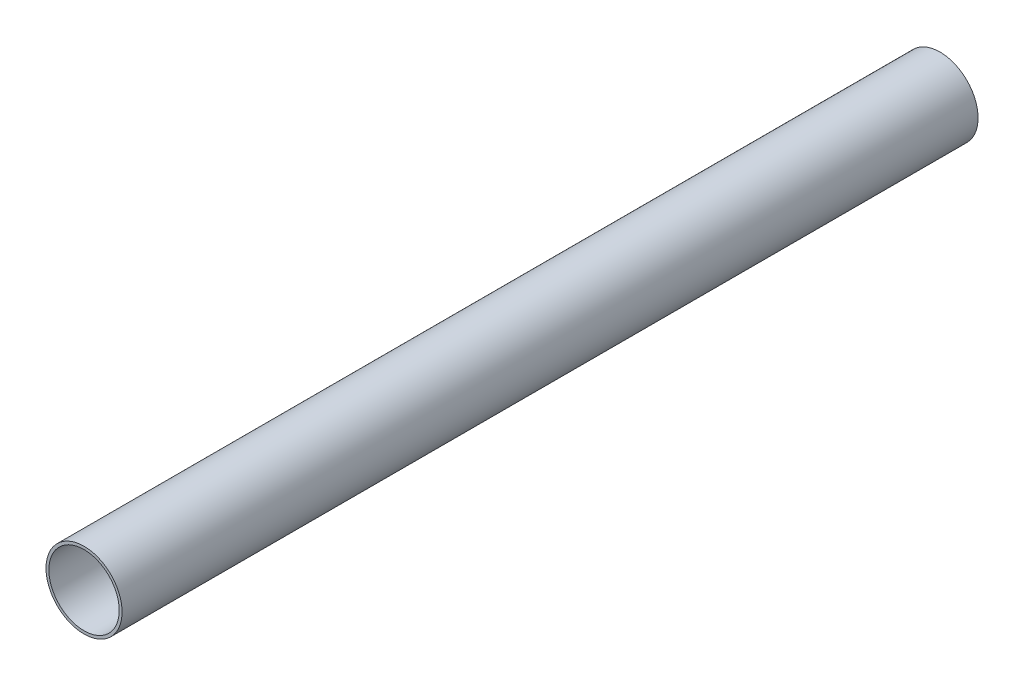
ISO-10303-21;
HEADER;
FILE_DESCRIPTION(('STEP AP214'),'2;1');
FILE_NAME('part.step','',(''),(''),'','','');
FILE_SCHEMA(('AUTOMOTIVE_DESIGN { 1 0 10303 214 1 1 1 1 }'));
ENDSEC;
DATA;
#1=APPLICATION_CONTEXT('core data for automotive mechanical design processes');
#2=APPLICATION_PROTOCOL_DEFINITION('international standard','automotive_design',2000,#1);
#3=PRODUCT_CONTEXT('',#1,'mechanical');
#4=PRODUCT('Part','Part','',(#3));
#5=PRODUCT_RELATED_PRODUCT_CATEGORY('part','',(#4));
#6=PRODUCT_DEFINITION_FORMATION('','',#4);
#7=PRODUCT_DEFINITION_CONTEXT('part definition',#1,'design');
#8=PRODUCT_DEFINITION('design','',#6,#7);
#9=PRODUCT_DEFINITION_SHAPE('','',#8);
#10=(LENGTH_UNIT() NAMED_UNIT(*) SI_UNIT(.MILLI.,.METRE.));
#11=(NAMED_UNIT(*) PLANE_ANGLE_UNIT() SI_UNIT($,.RADIAN.));
#12=(NAMED_UNIT(*) SI_UNIT($,.STERADIAN.) SOLID_ANGLE_UNIT());
#13=UNCERTAINTY_MEASURE_WITH_UNIT(LENGTH_MEASURE(1.E-05),#10,'distance_accuracy_value','');
#14=(GEOMETRIC_REPRESENTATION_CONTEXT(3) GLOBAL_UNCERTAINTY_ASSIGNED_CONTEXT((#13)) GLOBAL_UNIT_ASSIGNED_CONTEXT((#10,
#11,#12)) REPRESENTATION_CONTEXT('',''));
#15=CARTESIAN_POINT('',(0.,0.,0.));
#16=DIRECTION('',(0.,0.,1.));
#17=DIRECTION('',(1.,0.,0.));
#18=AXIS2_PLACEMENT_3D('',#15,#16,#17);
#19=CARTESIAN_POINT('',(0.,0.,180.));
#20=DIRECTION('',(0.,0.,1.));
#21=DIRECTION('',(1.,0.,0.));
#22=AXIS2_PLACEMENT_3D('',#19,#20,#21);
#23=PLANE('',#22);
#24=CARTESIAN_POINT('',(0.,0.,180.));
#25=DIRECTION('',(0.,0.,1.));
#26=DIRECTION('',(1.,0.,0.));
#27=AXIS2_PLACEMENT_3D('',#24,#25,#26);
#28=CIRCLE('',#27,8.);
#29=CARTESIAN_POINT('',(-8.,0.,180.));
#30=VERTEX_POINT('',#29);
#31=EDGE_CURVE('E12',#30,#30,#28,.T.);
#32=ORIENTED_EDGE('',*,*,#31,.T.);
#33=EDGE_LOOP('',(#32));
#34=FACE_BOUND('',#33,.T.);
#35=CARTESIAN_POINT('',(0.,0.,180.));
#36=DIRECTION('',(0.,0.,1.));
#37=DIRECTION('',(1.,0.,0.));
#38=AXIS2_PLACEMENT_3D('',#35,#36,#37);
#39=CIRCLE('',#38,7.4);
#40=CARTESIAN_POINT('',(-7.4,0.,180.));
#41=VERTEX_POINT('',#40);
#42=EDGE_CURVE('E50',#41,#41,#39,.T.);
#43=ORIENTED_EDGE('',*,*,#42,.F.);
#44=EDGE_LOOP('',(#43));
#45=FACE_BOUND('',#44,.T.);
#46=ADVANCED_FACE('F39',(#34,#45),#23,.T.);
#47=CARTESIAN_POINT('',(0.,0.,0.));
#48=DIRECTION('',(0.,0.,1.));
#49=DIRECTION('',(1.,0.,0.));
#50=AXIS2_PLACEMENT_3D('',#47,#48,#49);
#51=PLANE('',#50);
#52=CARTESIAN_POINT('',(0.,0.,0.));
#53=DIRECTION('',(0.,0.,1.));
#54=DIRECTION('',(1.,0.,0.));
#55=AXIS2_PLACEMENT_3D('',#52,#53,#54);
#56=CIRCLE('',#55,8.);
#57=CARTESIAN_POINT('',(-8.,0.,0.));
#58=VERTEX_POINT('',#57);
#59=EDGE_CURVE('E43',#58,#58,#56,.T.);
#60=ORIENTED_EDGE('',*,*,#59,.F.);
#61=EDGE_LOOP('',(#60));
#62=FACE_BOUND('',#61,.T.);
#63=CARTESIAN_POINT('',(0.,0.,0.));
#64=DIRECTION('',(0.,0.,1.));
#65=DIRECTION('',(1.,0.,0.));
#66=AXIS2_PLACEMENT_3D('',#63,#64,#65);
#67=CIRCLE('',#66,7.4);
#68=CARTESIAN_POINT('',(-7.4,0.,0.));
#69=VERTEX_POINT('',#68);
#70=EDGE_CURVE('E52',#69,#69,#67,.T.);
#71=ORIENTED_EDGE('',*,*,#70,.T.);
#72=EDGE_LOOP('',(#71));
#73=FACE_BOUND('',#72,.T.);
#74=ADVANCED_FACE('F62',(#62,#73),#51,.F.);
#75=CARTESIAN_POINT('',(0.,0.,180.));
#76=DIRECTION('',(0.,0.,-1.));
#77=DIRECTION('',(-1.,0.,0.));
#78=AXIS2_PLACEMENT_3D('',#75,#76,#77);
#79=CYLINDRICAL_SURFACE('',#78,8.);
#80=CARTESIAN_POINT('',(-8.,0.,180.));
#81=CARTESIAN_POINT('',(-8.,0.,178.125));
#82=CARTESIAN_POINT('',(-8.,0.,176.25));
#83=CARTESIAN_POINT('',(-8.,0.,172.5));
#84=CARTESIAN_POINT('',(-8.,0.,170.625));
#85=CARTESIAN_POINT('',(-8.,0.,166.875));
#86=CARTESIAN_POINT('',(-8.,0.,165.));
#87=CARTESIAN_POINT('',(-8.,0.,161.25));
#88=CARTESIAN_POINT('',(-8.,0.,159.375));
#89=CARTESIAN_POINT('',(-8.,0.,155.625));
#90=CARTESIAN_POINT('',(-8.,0.,153.75));
#91=CARTESIAN_POINT('',(-8.,0.,150.));
#92=CARTESIAN_POINT('',(-8.,0.,148.125));
#93=CARTESIAN_POINT('',(-8.,0.,144.375));
#94=CARTESIAN_POINT('',(-8.,0.,142.5));
#95=CARTESIAN_POINT('',(-8.,0.,138.75));
#96=CARTESIAN_POINT('',(-8.,0.,136.875));
#97=CARTESIAN_POINT('',(-8.,0.,133.125));
#98=CARTESIAN_POINT('',(-8.,0.,131.25));
#99=CARTESIAN_POINT('',(-8.,0.,127.5));
#100=CARTESIAN_POINT('',(-8.,0.,125.625));
#101=CARTESIAN_POINT('',(-8.,0.,121.875));
#102=CARTESIAN_POINT('',(-8.,0.,120.));
#103=CARTESIAN_POINT('',(-8.,0.,116.25));
#104=CARTESIAN_POINT('',(-8.,0.,114.375));
#105=CARTESIAN_POINT('',(-8.,0.,110.625));
#106=CARTESIAN_POINT('',(-8.,0.,108.75));
#107=CARTESIAN_POINT('',(-8.,0.,105.));
#108=CARTESIAN_POINT('',(-8.,0.,103.125));
#109=CARTESIAN_POINT('',(-8.,0.,99.375));
#110=CARTESIAN_POINT('',(-8.,0.,97.5));
#111=CARTESIAN_POINT('',(-8.,0.,93.75));
#112=CARTESIAN_POINT('',(-8.,0.,91.875));
#113=CARTESIAN_POINT('',(-8.,0.,88.125));
#114=CARTESIAN_POINT('',(-8.,0.,86.25));
#115=CARTESIAN_POINT('',(-8.,0.,82.5));
#116=CARTESIAN_POINT('',(-8.,0.,80.625));
#117=CARTESIAN_POINT('',(-8.,0.,76.875));
#118=CARTESIAN_POINT('',(-8.,0.,75.));
#119=CARTESIAN_POINT('',(-8.,0.,71.25));
#120=CARTESIAN_POINT('',(-8.,0.,69.375));
#121=CARTESIAN_POINT('',(-8.,0.,65.625));
#122=CARTESIAN_POINT('',(-8.,0.,63.75));
#123=CARTESIAN_POINT('',(-8.,0.,60.));
#124=CARTESIAN_POINT('',(-8.,0.,58.125));
#125=CARTESIAN_POINT('',(-8.,0.,54.375));
#126=CARTESIAN_POINT('',(-8.,0.,52.5));
#127=CARTESIAN_POINT('',(-8.,0.,48.75));
#128=CARTESIAN_POINT('',(-8.,0.,46.875));
#129=CARTESIAN_POINT('',(-8.,0.,43.125));
#130=CARTESIAN_POINT('',(-8.,0.,41.25));
#131=CARTESIAN_POINT('',(-8.,0.,37.5));
#132=CARTESIAN_POINT('',(-8.,0.,35.625));
#133=CARTESIAN_POINT('',(-8.,0.,31.875));
#134=CARTESIAN_POINT('',(-8.,0.,30.));
#135=CARTESIAN_POINT('',(-8.,0.,26.25));
#136=CARTESIAN_POINT('',(-8.,0.,24.375));
#137=CARTESIAN_POINT('',(-8.,0.,20.625));
#138=CARTESIAN_POINT('',(-8.,0.,18.75));
#139=CARTESIAN_POINT('',(-8.,0.,15.));
#140=CARTESIAN_POINT('',(-8.,0.,13.125));
#141=CARTESIAN_POINT('',(-8.,0.,9.37499999999998));
#142=CARTESIAN_POINT('',(-8.,0.,7.49999999999997));
#143=CARTESIAN_POINT('',(-8.,0.,3.74999999999997));
#144=CARTESIAN_POINT('',(-8.,0.,1.87499999999997));
#145=CARTESIAN_POINT('',(-8.,0.,0.));
#146=B_SPLINE_CURVE_WITH_KNOTS('',3,(#80,#81,#82,#83,#84,#85,#86,#87,#88,#89,#90,#91,#92,#93,
#94,#95,#96,#97,#98,#99,#100,#101,#102,#103,#104,#105,#106,#107,#108,#109,#110,#111,#112,#113,
#114,#115,#116,#117,#118,#119,#120,#121,#122,#123,#124,#125,#126,#127,#128,#129,#130,#131,#132,
#133,#134,#135,#136,#137,#138,#139,#140,#141,#142,#143,#144,#145),.UNSPECIFIED.,.F.,.F.,(4,2,2,
2,2,2,2,2,2,2,2,2,2,2,2,2,2,2,2,2,2,2,2,2,2,2,2,2,2,2,2,2,4),(0.,5.62499999999999,11.25,16.875,
22.5,28.125,33.75,39.375,45.,50.625,56.25,61.875,67.5,73.125,78.75,84.375,90.,95.625,101.25,
106.875,112.5,118.125,123.75,129.375,135.,140.625,146.25,151.875,157.5,163.125,168.75,174.375,
180.),.UNSPECIFIED.);
#147=EDGE_CURVE('BSEAM41',#30,#58,#146,.T.);
#148=ORIENTED_EDGE('',*,*,#31,.F.);
#149=ORIENTED_EDGE('',*,*,#59,.T.);
#150=ORIENTED_EDGE('',*,*,#147,.T.);
#151=ORIENTED_EDGE('',*,*,#147,.F.);
#152=EDGE_LOOP('',(#148,#150,#149,#151));
#153=FACE_BOUND('',#152,.T.);
#154=ADVANCED_FACE('F41',(#153),#79,.T.);
#155=CARTESIAN_POINT('',(0.,0.,180.));
#156=DIRECTION('',(0.,0.,-1.));
#157=DIRECTION('',(-1.,0.,0.));
#158=AXIS2_PLACEMENT_3D('',#155,#156,#157);
#159=CYLINDRICAL_SURFACE('',#158,7.4);
#160=CARTESIAN_POINT('',(-7.4,0.,180.));
#161=CARTESIAN_POINT('',(-7.4,0.,178.125));
#162=CARTESIAN_POINT('',(-7.4,0.,176.25));
#163=CARTESIAN_POINT('',(-7.4,0.,172.5));
#164=CARTESIAN_POINT('',(-7.4,0.,170.625));
#165=CARTESIAN_POINT('',(-7.4,0.,166.875));
#166=CARTESIAN_POINT('',(-7.4,0.,165.));
#167=CARTESIAN_POINT('',(-7.4,0.,161.25));
#168=CARTESIAN_POINT('',(-7.4,0.,159.375));
#169=CARTESIAN_POINT('',(-7.4,0.,155.625));
#170=CARTESIAN_POINT('',(-7.4,0.,153.75));
#171=CARTESIAN_POINT('',(-7.4,0.,150.));
#172=CARTESIAN_POINT('',(-7.4,0.,148.125));
#173=CARTESIAN_POINT('',(-7.4,0.,144.375));
#174=CARTESIAN_POINT('',(-7.4,0.,142.5));
#175=CARTESIAN_POINT('',(-7.4,0.,138.75));
#176=CARTESIAN_POINT('',(-7.4,0.,136.875));
#177=CARTESIAN_POINT('',(-7.4,0.,133.125));
#178=CARTESIAN_POINT('',(-7.4,0.,131.25));
#179=CARTESIAN_POINT('',(-7.4,0.,127.5));
#180=CARTESIAN_POINT('',(-7.4,0.,125.625));
#181=CARTESIAN_POINT('',(-7.4,0.,121.875));
#182=CARTESIAN_POINT('',(-7.4,0.,120.));
#183=CARTESIAN_POINT('',(-7.4,0.,116.25));
#184=CARTESIAN_POINT('',(-7.4,0.,114.375));
#185=CARTESIAN_POINT('',(-7.4,0.,110.625));
#186=CARTESIAN_POINT('',(-7.4,0.,108.75));
#187=CARTESIAN_POINT('',(-7.4,0.,105.));
#188=CARTESIAN_POINT('',(-7.4,0.,103.125));
#189=CARTESIAN_POINT('',(-7.4,0.,99.375));
#190=CARTESIAN_POINT('',(-7.4,0.,97.5));
#191=CARTESIAN_POINT('',(-7.4,0.,93.75));
#192=CARTESIAN_POINT('',(-7.4,0.,91.875));
#193=CARTESIAN_POINT('',(-7.4,0.,88.125));
#194=CARTESIAN_POINT('',(-7.4,0.,86.25));
#195=CARTESIAN_POINT('',(-7.4,0.,82.5));
#196=CARTESIAN_POINT('',(-7.4,0.,80.625));
#197=CARTESIAN_POINT('',(-7.4,0.,76.875));
#198=CARTESIAN_POINT('',(-7.4,0.,75.));
#199=CARTESIAN_POINT('',(-7.4,0.,71.25));
#200=CARTESIAN_POINT('',(-7.4,0.,69.375));
#201=CARTESIAN_POINT('',(-7.4,0.,65.625));
#202=CARTESIAN_POINT('',(-7.4,0.,63.75));
#203=CARTESIAN_POINT('',(-7.4,0.,60.));
#204=CARTESIAN_POINT('',(-7.4,0.,58.125));
#205=CARTESIAN_POINT('',(-7.4,0.,54.375));
#206=CARTESIAN_POINT('',(-7.4,0.,52.5));
#207=CARTESIAN_POINT('',(-7.4,0.,48.75));
#208=CARTESIAN_POINT('',(-7.4,0.,46.875));
#209=CARTESIAN_POINT('',(-7.4,0.,43.125));
#210=CARTESIAN_POINT('',(-7.4,0.,41.25));
#211=CARTESIAN_POINT('',(-7.4,0.,37.5));
#212=CARTESIAN_POINT('',(-7.4,0.,35.625));
#213=CARTESIAN_POINT('',(-7.4,0.,31.875));
#214=CARTESIAN_POINT('',(-7.4,0.,30.));
#215=CARTESIAN_POINT('',(-7.4,0.,26.25));
#216=CARTESIAN_POINT('',(-7.4,0.,24.375));
#217=CARTESIAN_POINT('',(-7.4,0.,20.625));
#218=CARTESIAN_POINT('',(-7.4,0.,18.75));
#219=CARTESIAN_POINT('',(-7.4,0.,15.));
#220=CARTESIAN_POINT('',(-7.4,0.,13.125));
#221=CARTESIAN_POINT('',(-7.4,0.,9.37499999999998));
#222=CARTESIAN_POINT('',(-7.4,0.,7.49999999999997));
#223=CARTESIAN_POINT('',(-7.4,0.,3.74999999999997));
#224=CARTESIAN_POINT('',(-7.4,0.,1.87499999999997));
#225=CARTESIAN_POINT('',(-7.4,0.,0.));
#226=B_SPLINE_CURVE_WITH_KNOTS('',3,(#160,#161,#162,#163,#164,#165,#166,#167,#168,#169,#170,
#171,#172,#173,#174,#175,#176,#177,#178,#179,#180,#181,#182,#183,#184,#185,#186,#187,#188,#189,
#190,#191,#192,#193,#194,#195,#196,#197,#198,#199,#200,#201,#202,#203,#204,#205,#206,#207,#208,
#209,#210,#211,#212,#213,#214,#215,#216,#217,#218,#219,#220,#221,#222,#223,#224,#225),
.UNSPECIFIED.,.F.,.F.,(4,2,2,2,2,2,2,2,2,2,2,2,2,2,2,2,2,2,2,2,2,2,2,2,2,2,2,2,2,2,2,2,4),(0.,
5.62500000000002,11.25,16.875,22.5,28.125,33.75,39.375,45.,50.625,56.25,61.875,67.5,73.125,
78.75,84.375,90.0000000000001,95.6250000000001,101.25,106.875,112.5,118.125,123.75,129.375,135.,
140.625,146.25,151.875,157.5,163.125,168.75,174.375,180.),.UNSPECIFIED.);
#227=EDGE_CURVE('BSEAM58',#41,#69,#226,.T.);
#228=ORIENTED_EDGE('',*,*,#42,.T.);
#229=ORIENTED_EDGE('',*,*,#70,.F.);
#230=ORIENTED_EDGE('',*,*,#227,.T.);
#231=ORIENTED_EDGE('',*,*,#227,.F.);
#232=EDGE_LOOP('',(#228,#230,#229,#231));
#233=FACE_BOUND('',#232,.T.);
#234=ADVANCED_FACE('F58',(#233),#159,.F.);
#235=CLOSED_SHELL('',(#46,#74,#154,#234));
#236=MANIFOLD_SOLID_BREP('B2',#235);
#237=ADVANCED_BREP_SHAPE_REPRESENTATION('',(#18,#236),#14);
#238=SHAPE_DEFINITION_REPRESENTATION(#9,#237);
ENDSEC;
END-ISO-10303-21;
